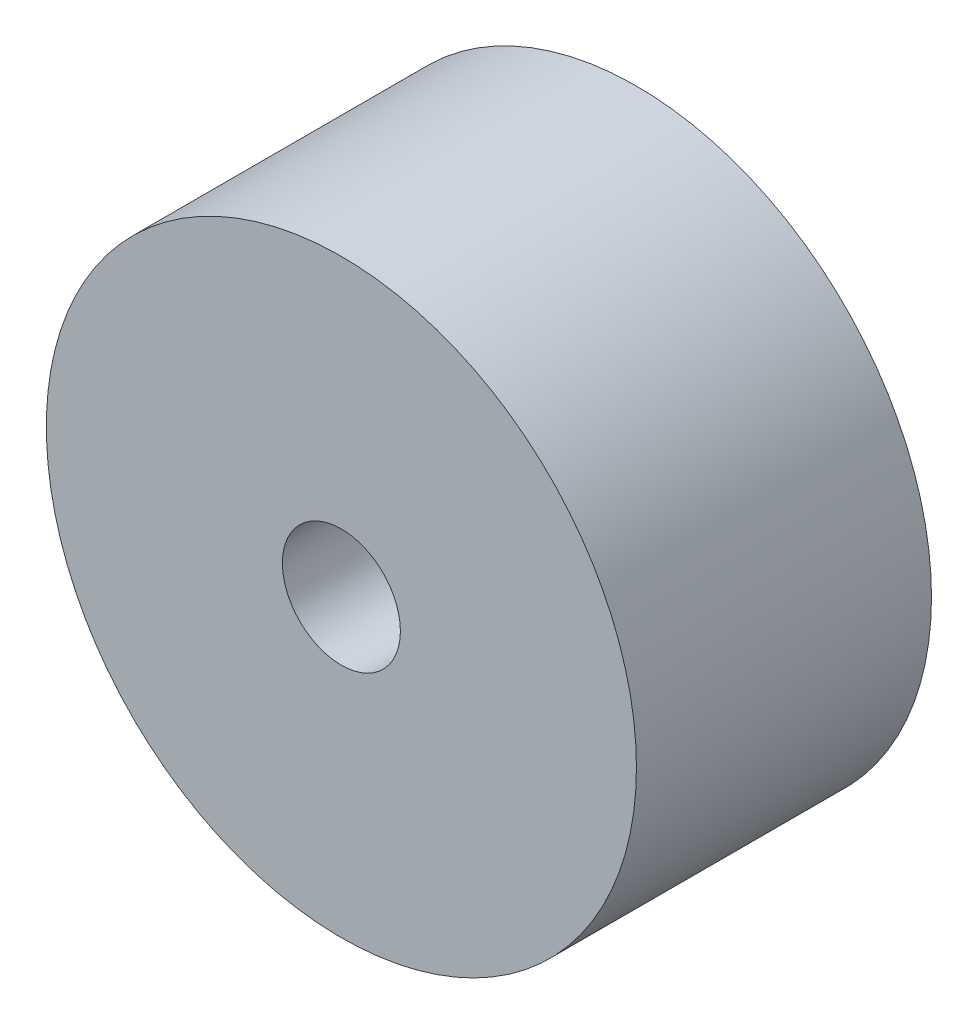
ISO-10303-21;
HEADER;
FILE_DESCRIPTION(('STEP AP214'),'2;1');
FILE_NAME('part.step','',(''),(''),'','','');
FILE_SCHEMA(('AUTOMOTIVE_DESIGN { 1 0 10303 214 1 1 1 1 }'));
ENDSEC;
DATA;
#1=APPLICATION_CONTEXT('core data for automotive mechanical design processes');
#2=APPLICATION_PROTOCOL_DEFINITION('international standard','automotive_design',2000,#1);
#3=PRODUCT_CONTEXT('',#1,'mechanical');
#4=PRODUCT('Part','Part','',(#3));
#5=PRODUCT_RELATED_PRODUCT_CATEGORY('part','',(#4));
#6=PRODUCT_DEFINITION_FORMATION('','',#4);
#7=PRODUCT_DEFINITION_CONTEXT('part definition',#1,'design');
#8=PRODUCT_DEFINITION('design','',#6,#7);
#9=PRODUCT_DEFINITION_SHAPE('','',#8);
#10=(LENGTH_UNIT() NAMED_UNIT(*) SI_UNIT(.MILLI.,.METRE.));
#11=(NAMED_UNIT(*) PLANE_ANGLE_UNIT() SI_UNIT($,.RADIAN.));
#12=(NAMED_UNIT(*) SI_UNIT($,.STERADIAN.) SOLID_ANGLE_UNIT());
#13=UNCERTAINTY_MEASURE_WITH_UNIT(LENGTH_MEASURE(1.E-05),#10,'distance_accuracy_value','');
#14=(GEOMETRIC_REPRESENTATION_CONTEXT(3) GLOBAL_UNCERTAINTY_ASSIGNED_CONTEXT((#13)) GLOBAL_UNIT_ASSIGNED_CONTEXT((#10,
#11,#12)) REPRESENTATION_CONTEXT('',''));
#15=CARTESIAN_POINT('',(0.,0.,0.));
#16=DIRECTION('',(0.,0.,1.));
#17=DIRECTION('',(1.,0.,0.));
#18=AXIS2_PLACEMENT_3D('',#15,#16,#17);
#19=CARTESIAN_POINT('',(0.,0.,50.));
#20=DIRECTION('',(0.,0.,1.));
#21=DIRECTION('',(1.,0.,0.));
#22=AXIS2_PLACEMENT_3D('',#19,#20,#21);
#23=PLANE('',#22);
#24=CARTESIAN_POINT('',(0.,0.,50.));
#25=DIRECTION('',(0.,0.,1.));
#26=DIRECTION('',(1.,0.,0.));
#27=AXIS2_PLACEMENT_3D('',#24,#25,#26);
#28=CIRCLE('',#27,50.);
#29=CARTESIAN_POINT('',(50.,0.,50.));
#30=VERTEX_POINT('',#29);
#31=EDGE_CURVE('E10',#30,#30,#28,.T.);
#32=ORIENTED_EDGE('',*,*,#31,.T.);
#33=EDGE_LOOP('',(#32));
#34=FACE_BOUND('',#33,.T.);
#35=CARTESIAN_POINT('',(0.,0.,50.));
#36=DIRECTION('',(0.,0.,1.));
#37=DIRECTION('',(1.,0.,0.));
#38=AXIS2_PLACEMENT_3D('',#35,#36,#37);
#39=CIRCLE('',#38,10.);
#40=CARTESIAN_POINT('',(10.,0.,50.));
#41=VERTEX_POINT('',#40);
#42=EDGE_CURVE('E54',#41,#41,#39,.T.);
#43=ORIENTED_EDGE('',*,*,#42,.F.);
#44=EDGE_LOOP('',(#43));
#45=FACE_BOUND('',#44,.T.);
#46=ADVANCED_FACE('F41',(#34,#45),#23,.T.);
#47=CARTESIAN_POINT('',(0.,0.,0.));
#48=DIRECTION('',(0.,0.,1.));
#49=DIRECTION('',(1.,0.,0.));
#50=AXIS2_PLACEMENT_3D('',#47,#48,#49);
#51=PLANE('',#50);
#52=CARTESIAN_POINT('',(0.,0.,0.));
#53=DIRECTION('',(0.,0.,1.));
#54=DIRECTION('',(1.,0.,0.));
#55=AXIS2_PLACEMENT_3D('',#52,#53,#54);
#56=CIRCLE('',#55,50.);
#57=CARTESIAN_POINT('',(50.,0.,0.));
#58=VERTEX_POINT('',#57);
#59=EDGE_CURVE('E45',#58,#58,#56,.T.);
#60=ORIENTED_EDGE('',*,*,#59,.F.);
#61=EDGE_LOOP('',(#60));
#62=FACE_BOUND('',#61,.T.);
#63=CARTESIAN_POINT('',(0.,0.,0.));
#64=DIRECTION('',(0.,0.,1.));
#65=DIRECTION('',(1.,0.,0.));
#66=AXIS2_PLACEMENT_3D('',#63,#64,#65);
#67=CIRCLE('',#66,10.);
#68=CARTESIAN_POINT('',(10.,0.,0.));
#69=VERTEX_POINT('',#68);
#70=EDGE_CURVE('E56',#69,#69,#67,.T.);
#71=ORIENTED_EDGE('',*,*,#70,.T.);
#72=EDGE_LOOP('',(#71));
#73=FACE_BOUND('',#72,.T.);
#74=ADVANCED_FACE('F68',(#62,#73),#51,.F.);
#75=CARTESIAN_POINT('',(0.,0.,50.));
#76=DIRECTION('',(0.,0.,-1.));
#77=DIRECTION('',(-1.,0.,0.));
#78=AXIS2_PLACEMENT_3D('',#75,#76,#77);
#79=CYLINDRICAL_SURFACE('',#78,50.);
#80=ORIENTED_EDGE('',*,*,#31,.F.);
#81=EDGE_LOOP('',(#80));
#82=FACE_BOUND('',#81,.T.);
#83=ORIENTED_EDGE('',*,*,#59,.T.);
#84=EDGE_LOOP('',(#83));
#85=FACE_BOUND('',#84,.T.);
#86=ADVANCED_FACE('F43',(#82,#85),#79,.T.);
#87=CARTESIAN_POINT('',(0.,0.,50.));
#88=DIRECTION('',(0.,0.,-1.));
#89=DIRECTION('',(-1.,0.,0.));
#90=AXIS2_PLACEMENT_3D('',#87,#88,#89);
#91=CYLINDRICAL_SURFACE('',#90,10.);
#92=ORIENTED_EDGE('',*,*,#42,.T.);
#93=EDGE_LOOP('',(#92));
#94=FACE_BOUND('',#93,.T.);
#95=ORIENTED_EDGE('',*,*,#70,.F.);
#96=EDGE_LOOP('',(#95));
#97=FACE_BOUND('',#96,.T.);
#98=ADVANCED_FACE('F64',(#94,#97),#91,.F.);
#99=CLOSED_SHELL('',(#46,#74,#86,#98));
#100=MANIFOLD_SOLID_BREP('B2',#99);
#101=ADVANCED_BREP_SHAPE_REPRESENTATION('',(#18,#100),#14);
#102=SHAPE_DEFINITION_REPRESENTATION(#9,#101);
ENDSEC;
END-ISO-10303-21;
